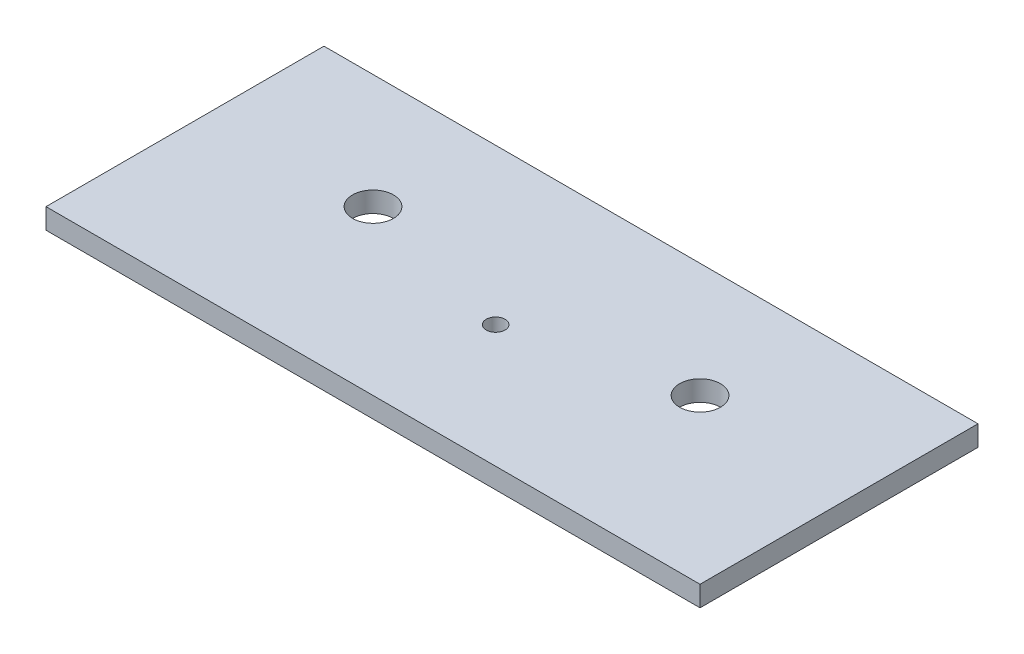
ISO-10303-21;
HEADER;
FILE_DESCRIPTION(('STEP AP214'),'2;1');
FILE_NAME('part.step','',(''),(''),'','','');
FILE_SCHEMA(('AUTOMOTIVE_DESIGN { 1 0 10303 214 1 1 1 1 }'));
ENDSEC;
DATA;
#1=APPLICATION_CONTEXT('core data for automotive mechanical design processes');
#2=APPLICATION_PROTOCOL_DEFINITION('international standard','automotive_design',2000,#1);
#3=PRODUCT_CONTEXT('',#1,'mechanical');
#4=PRODUCT('Part','Part','',(#3));
#5=PRODUCT_RELATED_PRODUCT_CATEGORY('part','',(#4));
#6=PRODUCT_DEFINITION_FORMATION('','',#4);
#7=PRODUCT_DEFINITION_CONTEXT('part definition',#1,'design');
#8=PRODUCT_DEFINITION('design','',#6,#7);
#9=PRODUCT_DEFINITION_SHAPE('','',#8);
#10=(LENGTH_UNIT() NAMED_UNIT(*) SI_UNIT(.MILLI.,.METRE.));
#11=(NAMED_UNIT(*) PLANE_ANGLE_UNIT() SI_UNIT($,.RADIAN.));
#12=(NAMED_UNIT(*) SI_UNIT($,.STERADIAN.) SOLID_ANGLE_UNIT());
#13=UNCERTAINTY_MEASURE_WITH_UNIT(LENGTH_MEASURE(1.E-05),#10,'distance_accuracy_value','');
#14=(GEOMETRIC_REPRESENTATION_CONTEXT(3) GLOBAL_UNCERTAINTY_ASSIGNED_CONTEXT((#13)) GLOBAL_UNIT_ASSIGNED_CONTEXT((#10,
#11,#12)) REPRESENTATION_CONTEXT('',''));
#15=CARTESIAN_POINT('',(0.,0.,0.));
#16=DIRECTION('',(0.,0.,1.));
#17=DIRECTION('',(1.,0.,0.));
#18=AXIS2_PLACEMENT_3D('',#15,#16,#17);
#19=CARTESIAN_POINT('',(-50.8,3.175,0.));
#20=DIRECTION('',(-1.,0.,0.));
#21=DIRECTION('',(0.,0.,1.));
#22=AXIS2_PLACEMENT_3D('',#19,#20,#21);
#23=PLANE('',#22);
#24=DIRECTION('',(0.,0.,-1.));
#25=VECTOR('',#24,1.);
#26=CARTESIAN_POINT('',(-50.8,0.,0.));
#27=LINE('',#26,#25);
#28=CARTESIAN_POINT('',(-50.8,0.,25.4));
#29=VERTEX_POINT('',#28);
#30=CARTESIAN_POINT('',(-50.8,0.,-17.78));
#31=VERTEX_POINT('',#30);
#32=EDGE_CURVE('E137',#29,#31,#27,.T.);
#33=ORIENTED_EDGE('',*,*,#32,.F.);
#34=DIRECTION('',(0.,-1.,0.));
#35=VECTOR('',#34,1.);
#36=CARTESIAN_POINT('',(-50.8,3.175,25.4));
#37=LINE('',#36,#35);
#38=CARTESIAN_POINT('',(-50.8,3.175,25.4));
#39=VERTEX_POINT('',#38);
#40=EDGE_CURVE('E11',#39,#29,#37,.T.);
#41=ORIENTED_EDGE('',*,*,#40,.F.);
#42=DIRECTION('',(0.,0.,-1.));
#43=VECTOR('',#42,1.);
#44=CARTESIAN_POINT('',(-50.8,3.175,0.));
#45=LINE('',#44,#43);
#46=CARTESIAN_POINT('',(-50.8,3.175,-17.78));
#47=VERTEX_POINT('',#46);
#48=EDGE_CURVE('E105',#39,#47,#45,.T.);
#49=ORIENTED_EDGE('',*,*,#48,.T.);
#50=DIRECTION('',(0.,-1.,0.));
#51=VECTOR('',#50,1.);
#52=CARTESIAN_POINT('',(-50.8,3.175,-17.78));
#53=LINE('',#52,#51);
#54=EDGE_CURVE('E65',#47,#31,#53,.T.);
#55=ORIENTED_EDGE('',*,*,#54,.T.);
#56=EDGE_LOOP('',(#33,#41,#49,#55));
#57=FACE_BOUND('',#56,.T.);
#58=ADVANCED_FACE('F47',(#57),#23,.T.);
#59=CARTESIAN_POINT('',(0.,3.175,25.4));
#60=DIRECTION('',(0.,0.,-1.));
#61=DIRECTION('',(-1.,0.,0.));
#62=AXIS2_PLACEMENT_3D('',#59,#60,#61);
#63=PLANE('',#62);
#64=DIRECTION('',(1.,0.,0.));
#65=VECTOR('',#64,1.);
#66=CARTESIAN_POINT('',(0.,0.,25.4));
#67=LINE('',#66,#65);
#68=CARTESIAN_POINT('',(50.8,0.,25.4));
#69=VERTEX_POINT('',#68);
#70=EDGE_CURVE('E111',#29,#69,#67,.T.);
#71=ORIENTED_EDGE('',*,*,#70,.T.);
#72=DIRECTION('',(0.,-1.,0.));
#73=VECTOR('',#72,1.);
#74=CARTESIAN_POINT('',(50.8,3.175,25.4));
#75=LINE('',#74,#73);
#76=CARTESIAN_POINT('',(50.8,3.175,25.4));
#77=VERTEX_POINT('',#76);
#78=EDGE_CURVE('E57',#77,#69,#75,.T.);
#79=ORIENTED_EDGE('',*,*,#78,.F.);
#80=DIRECTION('',(1.,0.,0.));
#81=VECTOR('',#80,1.);
#82=CARTESIAN_POINT('',(0.,3.175,25.4));
#83=LINE('',#82,#81);
#84=EDGE_CURVE('E100',#39,#77,#83,.T.);
#85=ORIENTED_EDGE('',*,*,#84,.F.);
#86=ORIENTED_EDGE('',*,*,#40,.T.);
#87=EDGE_LOOP('',(#71,#79,#85,#86));
#88=FACE_BOUND('',#87,.T.);
#89=ADVANCED_FACE('F109',(#88),#63,.F.);
#90=CARTESIAN_POINT('',(50.8,3.175,0.));
#91=DIRECTION('',(-1.,0.,0.));
#92=DIRECTION('',(0.,0.,1.));
#93=AXIS2_PLACEMENT_3D('',#90,#91,#92);
#94=PLANE('',#93);
#95=DIRECTION('',(0.,0.,-1.));
#96=VECTOR('',#95,1.);
#97=CARTESIAN_POINT('',(50.8,0.,0.));
#98=LINE('',#97,#96);
#99=CARTESIAN_POINT('',(50.8,0.,-17.78));
#100=VERTEX_POINT('',#99);
#101=EDGE_CURVE('E132',#69,#100,#98,.T.);
#102=ORIENTED_EDGE('',*,*,#101,.T.);
#103=DIRECTION('',(0.,-1.,0.));
#104=VECTOR('',#103,1.);
#105=CARTESIAN_POINT('',(50.8,3.175,-17.78));
#106=LINE('',#105,#104);
#107=CARTESIAN_POINT('',(50.8,3.175,-17.78));
#108=VERTEX_POINT('',#107);
#109=EDGE_CURVE('E79',#108,#100,#106,.T.);
#110=ORIENTED_EDGE('',*,*,#109,.F.);
#111=DIRECTION('',(0.,0.,-1.));
#112=VECTOR('',#111,1.);
#113=CARTESIAN_POINT('',(50.8,3.175,0.));
#114=LINE('',#113,#112);
#115=EDGE_CURVE('E91',#77,#108,#114,.T.);
#116=ORIENTED_EDGE('',*,*,#115,.F.);
#117=ORIENTED_EDGE('',*,*,#78,.T.);
#118=EDGE_LOOP('',(#102,#110,#116,#117));
#119=FACE_BOUND('',#118,.T.);
#120=ADVANCED_FACE('F93',(#119),#94,.F.);
#121=CARTESIAN_POINT('',(25.4,3.175,0.));
#122=DIRECTION('',(0.,-1.,0.));
#123=DIRECTION('',(0.,0.,-1.));
#124=AXIS2_PLACEMENT_3D('',#121,#122,#123);
#125=CYLINDRICAL_SURFACE('',#124,3.175);
#126=CARTESIAN_POINT('',(25.4,3.175,0.));
#127=DIRECTION('',(0.,1.,0.));
#128=DIRECTION('',(0.,0.,1.));
#129=AXIS2_PLACEMENT_3D('',#126,#127,#128);
#130=CIRCLE('',#129,3.175);
#131=CARTESIAN_POINT('',(25.4,3.175,3.175));
#132=VERTEX_POINT('',#131);
#133=EDGE_CURVE('E147',#132,#132,#130,.T.);
#134=ORIENTED_EDGE('',*,*,#133,.T.);
#135=EDGE_LOOP('',(#134));
#136=FACE_BOUND('',#135,.T.);
#137=CARTESIAN_POINT('',(25.4,0.,0.));
#138=DIRECTION('',(0.,1.,0.));
#139=DIRECTION('',(0.,0.,1.));
#140=AXIS2_PLACEMENT_3D('',#137,#138,#139);
#141=CIRCLE('',#140,3.175);
#142=CARTESIAN_POINT('',(25.4,0.,3.175));
#143=VERTEX_POINT('',#142);
#144=EDGE_CURVE('E124',#143,#143,#141,.T.);
#145=ORIENTED_EDGE('',*,*,#144,.F.);
#146=EDGE_LOOP('',(#145));
#147=FACE_BOUND('',#146,.T.);
#148=ADVANCED_FACE('F181',(#136,#147),#125,.F.);
#149=CARTESIAN_POINT('',(0.,3.175,-17.78));
#150=DIRECTION('',(0.,0.,-1.));
#151=DIRECTION('',(-1.,0.,0.));
#152=AXIS2_PLACEMENT_3D('',#149,#150,#151);
#153=PLANE('',#152);
#154=DIRECTION('',(1.,0.,0.));
#155=VECTOR('',#154,1.);
#156=CARTESIAN_POINT('',(0.,0.,-17.78));
#157=LINE('',#156,#155);
#158=EDGE_CURVE('E128',#31,#100,#157,.T.);
#159=ORIENTED_EDGE('',*,*,#158,.F.);
#160=ORIENTED_EDGE('',*,*,#54,.F.);
#161=DIRECTION('',(1.,0.,0.));
#162=VECTOR('',#161,1.);
#163=CARTESIAN_POINT('',(0.,3.175,-17.78));
#164=LINE('',#163,#162);
#165=EDGE_CURVE('E99',#47,#108,#164,.T.);
#166=ORIENTED_EDGE('',*,*,#165,.T.);
#167=ORIENTED_EDGE('',*,*,#109,.T.);
#168=EDGE_LOOP('',(#159,#160,#166,#167));
#169=FACE_BOUND('',#168,.T.);
#170=ADVANCED_FACE('F182',(#169),#153,.T.);
#171=CARTESIAN_POINT('',(0.,3.175,6.35));
#172=DIRECTION('',(0.,-1.,0.));
#173=DIRECTION('',(0.,0.,-1.));
#174=AXIS2_PLACEMENT_3D('',#171,#172,#173);
#175=CYLINDRICAL_SURFACE('',#174,1.4605);
#176=CARTESIAN_POINT('',(0.,3.175,6.35));
#177=DIRECTION('',(0.,1.,0.));
#178=DIRECTION('',(0.,0.,1.));
#179=AXIS2_PLACEMENT_3D('',#176,#177,#178);
#180=CIRCLE('',#179,1.4605);
#181=CARTESIAN_POINT('',(0.,3.175,7.8105));
#182=VERTEX_POINT('',#181);
#183=EDGE_CURVE('E123',#182,#182,#180,.T.);
#184=ORIENTED_EDGE('',*,*,#183,.T.);
#185=EDGE_LOOP('',(#184));
#186=FACE_BOUND('',#185,.T.);
#187=CARTESIAN_POINT('',(0.,0.,6.35));
#188=DIRECTION('',(0.,1.,0.));
#189=DIRECTION('',(0.,0.,1.));
#190=AXIS2_PLACEMENT_3D('',#187,#188,#189);
#191=CIRCLE('',#190,1.4605);
#192=CARTESIAN_POINT('',(0.,0.,7.8105));
#193=VERTEX_POINT('',#192);
#194=EDGE_CURVE('E140',#193,#193,#191,.T.);
#195=ORIENTED_EDGE('',*,*,#194,.F.);
#196=EDGE_LOOP('',(#195));
#197=FACE_BOUND('',#196,.T.);
#198=ADVANCED_FACE('F49',(#186,#197),#175,.F.);
#199=CARTESIAN_POINT('',(-25.4,3.175,0.));
#200=DIRECTION('',(0.,-1.,0.));
#201=DIRECTION('',(0.,0.,-1.));
#202=AXIS2_PLACEMENT_3D('',#199,#200,#201);
#203=CYLINDRICAL_SURFACE('',#202,3.175);
#204=CARTESIAN_POINT('',(-25.4,3.175,0.));
#205=DIRECTION('',(0.,1.,0.));
#206=DIRECTION('',(0.,0.,1.));
#207=AXIS2_PLACEMENT_3D('',#204,#205,#206);
#208=CIRCLE('',#207,3.175);
#209=CARTESIAN_POINT('',(-25.4,3.175,3.175));
#210=VERTEX_POINT('',#209);
#211=EDGE_CURVE('E118',#210,#210,#208,.F.);
#212=ORIENTED_EDGE('',*,*,#211,.F.);
#213=EDGE_LOOP('',(#212));
#214=FACE_BOUND('',#213,.T.);
#215=CARTESIAN_POINT('',(-25.4,0.,0.));
#216=DIRECTION('',(0.,1.,0.));
#217=DIRECTION('',(0.,0.,1.));
#218=AXIS2_PLACEMENT_3D('',#215,#216,#217);
#219=CIRCLE('',#218,3.175);
#220=CARTESIAN_POINT('',(-25.4,0.,3.175));
#221=VERTEX_POINT('',#220);
#222=EDGE_CURVE('E119',#221,#221,#219,.F.);
#223=ORIENTED_EDGE('',*,*,#222,.T.);
#224=EDGE_LOOP('',(#223));
#225=FACE_BOUND('',#224,.T.);
#226=ADVANCED_FACE('F163',(#214,#225),#203,.F.);
#227=CARTESIAN_POINT('',(0.,3.175,0.));
#228=DIRECTION('',(0.,1.,0.));
#229=DIRECTION('',(0.,0.,1.));
#230=AXIS2_PLACEMENT_3D('',#227,#228,#229);
#231=PLANE('',#230);
#232=ORIENTED_EDGE('',*,*,#183,.F.);
#233=EDGE_LOOP('',(#232));
#234=FACE_BOUND('',#233,.T.);
#235=ORIENTED_EDGE('',*,*,#48,.F.);
#236=ORIENTED_EDGE('',*,*,#84,.T.);
#237=ORIENTED_EDGE('',*,*,#115,.T.);
#238=ORIENTED_EDGE('',*,*,#165,.F.);
#239=EDGE_LOOP('',(#235,#236,#237,#238));
#240=FACE_BOUND('',#239,.T.);
#241=ORIENTED_EDGE('',*,*,#133,.F.);
#242=EDGE_LOOP('',(#241));
#243=FACE_BOUND('',#242,.T.);
#244=ORIENTED_EDGE('',*,*,#211,.T.);
#245=EDGE_LOOP('',(#244));
#246=FACE_BOUND('',#245,.T.);
#247=ADVANCED_FACE('F103',(#234,#240,#243,#246),#231,.T.);
#248=CARTESIAN_POINT('',(0.,0.,0.));
#249=DIRECTION('',(0.,1.,0.));
#250=DIRECTION('',(0.,0.,1.));
#251=AXIS2_PLACEMENT_3D('',#248,#249,#250);
#252=PLANE('',#251);
#253=ORIENTED_EDGE('',*,*,#194,.T.);
#254=EDGE_LOOP('',(#253));
#255=FACE_BOUND('',#254,.T.);
#256=ORIENTED_EDGE('',*,*,#32,.T.);
#257=ORIENTED_EDGE('',*,*,#158,.T.);
#258=ORIENTED_EDGE('',*,*,#101,.F.);
#259=ORIENTED_EDGE('',*,*,#70,.F.);
#260=EDGE_LOOP('',(#256,#257,#258,#259));
#261=FACE_BOUND('',#260,.T.);
#262=ORIENTED_EDGE('',*,*,#144,.T.);
#263=EDGE_LOOP('',(#262));
#264=FACE_BOUND('',#263,.T.);
#265=ORIENTED_EDGE('',*,*,#222,.F.);
#266=EDGE_LOOP('',(#265));
#267=FACE_BOUND('',#266,.T.);
#268=ADVANCED_FACE('F162',(#255,#261,#264,#267),#252,.F.);
#269=CLOSED_SHELL('',(#58,#89,#120,#148,#170,#198,#226,#247,#268));
#270=MANIFOLD_SOLID_BREP('B2',#269);
#271=ADVANCED_BREP_SHAPE_REPRESENTATION('',(#18,#270),#14);
#272=SHAPE_DEFINITION_REPRESENTATION(#9,#271);
ENDSEC;
END-ISO-10303-21;
